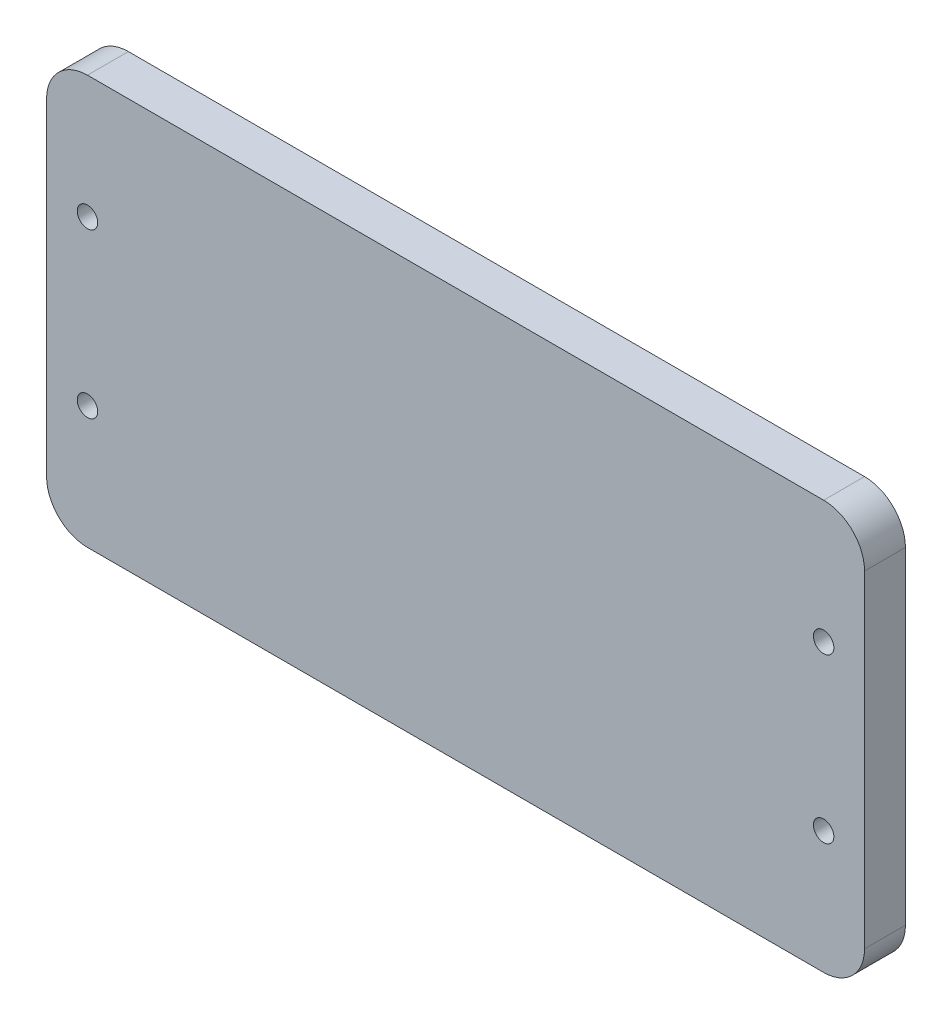
ISO-10303-21;
HEADER;
FILE_DESCRIPTION(('STEP AP214'),'2;1');
FILE_NAME('part.step','',(''),(''),'','','');
FILE_SCHEMA(('AUTOMOTIVE_DESIGN { 1 0 10303 214 1 1 1 1 }'));
ENDSEC;
DATA;
#1=APPLICATION_CONTEXT('core data for automotive mechanical design processes');
#2=APPLICATION_PROTOCOL_DEFINITION('international standard','automotive_design',2000,#1);
#3=PRODUCT_CONTEXT('',#1,'mechanical');
#4=PRODUCT('Part','Part','',(#3));
#5=PRODUCT_RELATED_PRODUCT_CATEGORY('part','',(#4));
#6=PRODUCT_DEFINITION_FORMATION('','',#4);
#7=PRODUCT_DEFINITION_CONTEXT('part definition',#1,'design');
#8=PRODUCT_DEFINITION('design','',#6,#7);
#9=PRODUCT_DEFINITION_SHAPE('','',#8);
#10=(LENGTH_UNIT() NAMED_UNIT(*) SI_UNIT(.MILLI.,.METRE.));
#11=(NAMED_UNIT(*) PLANE_ANGLE_UNIT() SI_UNIT($,.RADIAN.));
#12=(NAMED_UNIT(*) SI_UNIT($,.STERADIAN.) SOLID_ANGLE_UNIT());
#13=UNCERTAINTY_MEASURE_WITH_UNIT(LENGTH_MEASURE(1.E-05),#10,'distance_accuracy_value','');
#14=(GEOMETRIC_REPRESENTATION_CONTEXT(3) GLOBAL_UNCERTAINTY_ASSIGNED_CONTEXT((#13)) GLOBAL_UNIT_ASSIGNED_CONTEXT((#10,
#11,#12)) REPRESENTATION_CONTEXT('',''));
#15=CARTESIAN_POINT('',(0.,0.,0.));
#16=DIRECTION('',(0.,0.,1.));
#17=DIRECTION('',(1.,0.,0.));
#18=AXIS2_PLACEMENT_3D('',#15,#16,#17);
#19=CARTESIAN_POINT('',(0.,0.,10.));
#20=DIRECTION('',(0.,0.,1.));
#21=DIRECTION('',(1.,0.,0.));
#22=AXIS2_PLACEMENT_3D('',#19,#20,#21);
#23=PLANE('',#22);
#24=CARTESIAN_POINT('',(90.,-20.,10.));
#25=DIRECTION('',(0.,0.,1.));
#26=DIRECTION('',(-1.,0.,0.));
#27=AXIS2_PLACEMENT_3D('',#24,#25,#26);
#28=CIRCLE('',#27,2.5);
#29=CARTESIAN_POINT('',(87.5,-20.,10.));
#30=VERTEX_POINT('',#29);
#31=EDGE_CURVE('E188',#30,#30,#28,.T.);
#32=ORIENTED_EDGE('',*,*,#31,.F.);
#33=EDGE_LOOP('',(#32));
#34=FACE_BOUND('',#33,.T.);
#35=CARTESIAN_POINT('',(90.,20.,10.));
#36=DIRECTION('',(0.,0.,1.));
#37=DIRECTION('',(1.,0.,0.));
#38=AXIS2_PLACEMENT_3D('',#35,#36,#37);
#39=CIRCLE('',#38,2.5);
#40=CARTESIAN_POINT('',(92.5,20.,10.));
#41=VERTEX_POINT('',#40);
#42=EDGE_CURVE('E172',#41,#41,#39,.T.);
#43=ORIENTED_EDGE('',*,*,#42,.F.);
#44=EDGE_LOOP('',(#43));
#45=FACE_BOUND('',#44,.T.);
#46=DIRECTION('',(0.,-1.,0.));
#47=VECTOR('',#46,1.);
#48=CARTESIAN_POINT('',(-100.,50.,10.));
#49=LINE('',#48,#47);
#50=CARTESIAN_POINT('',(-100.,40.,10.));
#51=VERTEX_POINT('',#50);
#52=CARTESIAN_POINT('',(-100.,-40.,10.));
#53=VERTEX_POINT('',#52);
#54=EDGE_CURVE('E176',#51,#53,#49,.T.);
#55=ORIENTED_EDGE('',*,*,#54,.T.);
#56=CARTESIAN_POINT('',(-90.,-40.,10.));
#57=DIRECTION('',(0.,0.,1.));
#58=DIRECTION('',(1.,0.,0.));
#59=AXIS2_PLACEMENT_3D('',#56,#57,#58);
#60=CIRCLE('',#59,10.);
#61=CARTESIAN_POINT('',(-90.,-50.,10.));
#62=VERTEX_POINT('',#61);
#63=EDGE_CURVE('E153',#53,#62,#60,.T.);
#64=ORIENTED_EDGE('',*,*,#63,.T.);
#65=DIRECTION('',(1.,0.,0.));
#66=VECTOR('',#65,1.);
#67=CARTESIAN_POINT('',(-100.,-50.,10.));
#68=LINE('',#67,#66);
#69=CARTESIAN_POINT('',(90.,-50.,10.));
#70=VERTEX_POINT('',#69);
#71=EDGE_CURVE('E124',#62,#70,#68,.T.);
#72=ORIENTED_EDGE('',*,*,#71,.T.);
#73=CARTESIAN_POINT('',(90.,-40.,10.));
#74=DIRECTION('',(0.,0.,1.));
#75=DIRECTION('',(1.,0.,0.));
#76=AXIS2_PLACEMENT_3D('',#73,#74,#75);
#77=CIRCLE('',#76,10.);
#78=CARTESIAN_POINT('',(100.,-40.,10.));
#79=VERTEX_POINT('',#78);
#80=EDGE_CURVE('E149',#70,#79,#77,.T.);
#81=ORIENTED_EDGE('',*,*,#80,.T.);
#82=DIRECTION('',(0.,1.,0.));
#83=VECTOR('',#82,1.);
#84=CARTESIAN_POINT('',(100.,50.,10.));
#85=LINE('',#84,#83);
#86=CARTESIAN_POINT('',(100.,40.,10.));
#87=VERTEX_POINT('',#86);
#88=EDGE_CURVE('E132',#79,#87,#85,.T.);
#89=ORIENTED_EDGE('',*,*,#88,.T.);
#90=CARTESIAN_POINT('',(90.,40.,10.));
#91=DIRECTION('',(0.,0.,1.));
#92=DIRECTION('',(1.,0.,0.));
#93=AXIS2_PLACEMENT_3D('',#90,#91,#92);
#94=CIRCLE('',#93,10.);
#95=CARTESIAN_POINT('',(90.,50.,10.));
#96=VERTEX_POINT('',#95);
#97=EDGE_CURVE('E59',#87,#96,#94,.T.);
#98=ORIENTED_EDGE('',*,*,#97,.T.);
#99=DIRECTION('',(-1.,0.,0.));
#100=VECTOR('',#99,1.);
#101=CARTESIAN_POINT('',(-100.,50.,10.));
#102=LINE('',#101,#100);
#103=CARTESIAN_POINT('',(-90.,50.,10.));
#104=VERTEX_POINT('',#103);
#105=EDGE_CURVE('E135',#96,#104,#102,.T.);
#106=ORIENTED_EDGE('',*,*,#105,.T.);
#107=CARTESIAN_POINT('',(-90.,40.,10.));
#108=DIRECTION('',(0.,0.,1.));
#109=DIRECTION('',(1.,0.,0.));
#110=AXIS2_PLACEMENT_3D('',#107,#108,#109);
#111=CIRCLE('',#110,10.);
#112=EDGE_CURVE('E151',#104,#51,#111,.T.);
#113=ORIENTED_EDGE('',*,*,#112,.T.);
#114=EDGE_LOOP('',(#55,#64,#72,#81,#89,#98,#106,#113));
#115=FACE_BOUND('',#114,.T.);
#116=CARTESIAN_POINT('',(-90.,20.,10.));
#117=DIRECTION('',(0.,0.,1.));
#118=DIRECTION('',(-1.,0.,0.));
#119=AXIS2_PLACEMENT_3D('',#116,#117,#118);
#120=CIRCLE('',#119,2.5);
#121=CARTESIAN_POINT('',(-92.5,20.,10.));
#122=VERTEX_POINT('',#121);
#123=EDGE_CURVE('E182',#122,#122,#120,.T.);
#124=ORIENTED_EDGE('',*,*,#123,.F.);
#125=EDGE_LOOP('',(#124));
#126=FACE_BOUND('',#125,.T.);
#127=CARTESIAN_POINT('',(-90.,-20.,10.));
#128=DIRECTION('',(0.,0.,1.));
#129=DIRECTION('',(1.,0.,0.));
#130=AXIS2_PLACEMENT_3D('',#127,#128,#129);
#131=CIRCLE('',#130,2.5);
#132=CARTESIAN_POINT('',(-87.5,-20.,10.));
#133=VERTEX_POINT('',#132);
#134=EDGE_CURVE('E194',#133,#133,#131,.T.);
#135=ORIENTED_EDGE('',*,*,#134,.F.);
#136=EDGE_LOOP('',(#135));
#137=FACE_BOUND('',#136,.T.);
#138=ADVANCED_FACE('F37',(#34,#45,#115,#126,#137),#23,.T.);
#139=CARTESIAN_POINT('',(0.,0.,0.));
#140=DIRECTION('',(0.,0.,1.));
#141=DIRECTION('',(1.,0.,0.));
#142=AXIS2_PLACEMENT_3D('',#139,#140,#141);
#143=PLANE('',#142);
#144=DIRECTION('',(1.,0.,0.));
#145=VECTOR('',#144,1.);
#146=CARTESIAN_POINT('',(-100.,-50.,0.));
#147=LINE('',#146,#145);
#148=CARTESIAN_POINT('',(-90.,-50.,0.));
#149=VERTEX_POINT('',#148);
#150=CARTESIAN_POINT('',(90.,-50.,0.));
#151=VERTEX_POINT('',#150);
#152=EDGE_CURVE('E121',#149,#151,#147,.T.);
#153=ORIENTED_EDGE('',*,*,#152,.F.);
#154=CARTESIAN_POINT('',(-90.,-40.,0.));
#155=DIRECTION('',(0.,0.,1.));
#156=DIRECTION('',(1.,0.,0.));
#157=AXIS2_PLACEMENT_3D('',#154,#155,#156);
#158=CIRCLE('',#157,10.);
#159=CARTESIAN_POINT('',(-100.,-40.,0.));
#160=VERTEX_POINT('',#159);
#161=EDGE_CURVE('E104',#149,#160,#158,.F.);
#162=ORIENTED_EDGE('',*,*,#161,.T.);
#163=DIRECTION('',(0.,-1.,0.));
#164=VECTOR('',#163,1.);
#165=CARTESIAN_POINT('',(-100.,50.,0.));
#166=LINE('',#165,#164);
#167=CARTESIAN_POINT('',(-100.,40.,0.));
#168=VERTEX_POINT('',#167);
#169=EDGE_CURVE('E133',#168,#160,#166,.T.);
#170=ORIENTED_EDGE('',*,*,#169,.F.);
#171=CARTESIAN_POINT('',(-90.,40.,0.));
#172=DIRECTION('',(0.,0.,1.));
#173=DIRECTION('',(1.,0.,0.));
#174=AXIS2_PLACEMENT_3D('',#171,#172,#173);
#175=CIRCLE('',#174,10.);
#176=CARTESIAN_POINT('',(-90.,50.,0.));
#177=VERTEX_POINT('',#176);
#178=EDGE_CURVE('E115',#168,#177,#175,.F.);
#179=ORIENTED_EDGE('',*,*,#178,.T.);
#180=DIRECTION('',(-1.,0.,0.));
#181=VECTOR('',#180,1.);
#182=CARTESIAN_POINT('',(-100.,50.,0.));
#183=LINE('',#182,#181);
#184=CARTESIAN_POINT('',(90.,50.,0.));
#185=VERTEX_POINT('',#184);
#186=EDGE_CURVE('E137',#185,#177,#183,.T.);
#187=ORIENTED_EDGE('',*,*,#186,.F.);
#188=CARTESIAN_POINT('',(90.,40.,0.));
#189=DIRECTION('',(0.,0.,1.));
#190=DIRECTION('',(1.,0.,0.));
#191=AXIS2_PLACEMENT_3D('',#188,#189,#190);
#192=CIRCLE('',#191,10.);
#193=CARTESIAN_POINT('',(100.,40.,0.));
#194=VERTEX_POINT('',#193);
#195=EDGE_CURVE('E125',#185,#194,#192,.F.);
#196=ORIENTED_EDGE('',*,*,#195,.T.);
#197=DIRECTION('',(0.,1.,0.));
#198=VECTOR('',#197,1.);
#199=CARTESIAN_POINT('',(100.,50.,0.));
#200=LINE('',#199,#198);
#201=CARTESIAN_POINT('',(100.,-40.,0.));
#202=VERTEX_POINT('',#201);
#203=EDGE_CURVE('E164',#202,#194,#200,.T.);
#204=ORIENTED_EDGE('',*,*,#203,.F.);
#205=CARTESIAN_POINT('',(90.,-40.,0.));
#206=DIRECTION('',(0.,0.,1.));
#207=DIRECTION('',(1.,0.,0.));
#208=AXIS2_PLACEMENT_3D('',#205,#206,#207);
#209=CIRCLE('',#208,10.);
#210=EDGE_CURVE('E131',#202,#151,#209,.F.);
#211=ORIENTED_EDGE('',*,*,#210,.T.);
#212=EDGE_LOOP('',(#153,#162,#170,#179,#187,#196,#204,#211));
#213=FACE_BOUND('',#212,.T.);
#214=CARTESIAN_POINT('',(90.,20.,0.));
#215=DIRECTION('',(0.,0.,1.));
#216=DIRECTION('',(1.,0.,0.));
#217=AXIS2_PLACEMENT_3D('',#214,#215,#216);
#218=CIRCLE('',#217,2.5);
#219=CARTESIAN_POINT('',(92.5,20.,0.));
#220=VERTEX_POINT('',#219);
#221=EDGE_CURVE('E179',#220,#220,#218,.T.);
#222=ORIENTED_EDGE('',*,*,#221,.T.);
#223=EDGE_LOOP('',(#222));
#224=FACE_BOUND('',#223,.T.);
#225=CARTESIAN_POINT('',(-90.,20.,0.));
#226=DIRECTION('',(0.,0.,1.));
#227=DIRECTION('',(-1.,0.,0.));
#228=AXIS2_PLACEMENT_3D('',#225,#226,#227);
#229=CIRCLE('',#228,2.5);
#230=CARTESIAN_POINT('',(-92.5,20.,0.));
#231=VERTEX_POINT('',#230);
#232=EDGE_CURVE('E185',#231,#231,#229,.T.);
#233=ORIENTED_EDGE('',*,*,#232,.T.);
#234=EDGE_LOOP('',(#233));
#235=FACE_BOUND('',#234,.T.);
#236=CARTESIAN_POINT('',(90.,-20.,0.));
#237=DIRECTION('',(0.,0.,1.));
#238=DIRECTION('',(-1.,0.,0.));
#239=AXIS2_PLACEMENT_3D('',#236,#237,#238);
#240=CIRCLE('',#239,2.5);
#241=CARTESIAN_POINT('',(87.5,-20.,0.));
#242=VERTEX_POINT('',#241);
#243=EDGE_CURVE('E191',#242,#242,#240,.T.);
#244=ORIENTED_EDGE('',*,*,#243,.T.);
#245=EDGE_LOOP('',(#244));
#246=FACE_BOUND('',#245,.T.);
#247=CARTESIAN_POINT('',(-90.,-20.,0.));
#248=DIRECTION('',(0.,0.,1.));
#249=DIRECTION('',(1.,0.,0.));
#250=AXIS2_PLACEMENT_3D('',#247,#248,#249);
#251=CIRCLE('',#250,2.5);
#252=CARTESIAN_POINT('',(-87.5,-20.,0.));
#253=VERTEX_POINT('',#252);
#254=EDGE_CURVE('E197',#253,#253,#251,.T.);
#255=ORIENTED_EDGE('',*,*,#254,.T.);
#256=EDGE_LOOP('',(#255));
#257=FACE_BOUND('',#256,.T.);
#258=ADVANCED_FACE('F128',(#213,#224,#235,#246,#257),#143,.F.);
#259=CARTESIAN_POINT('',(100.,50.,10.));
#260=DIRECTION('',(-1.,0.,0.));
#261=DIRECTION('',(0.,-1.,0.));
#262=AXIS2_PLACEMENT_3D('',#259,#260,#261);
#263=PLANE('',#262);
#264=ORIENTED_EDGE('',*,*,#88,.F.);
#265=DIRECTION('',(0.,0.,-1.));
#266=VECTOR('',#265,1.);
#267=CARTESIAN_POINT('',(100.,-40.,10.));
#268=LINE('',#267,#266);
#269=EDGE_CURVE('E11',#79,#202,#268,.T.);
#270=ORIENTED_EDGE('',*,*,#269,.T.);
#271=ORIENTED_EDGE('',*,*,#203,.T.);
#272=DIRECTION('',(0.,0.,-1.));
#273=VECTOR('',#272,1.);
#274=CARTESIAN_POINT('',(100.,40.,10.));
#275=LINE('',#274,#273);
#276=EDGE_CURVE('E45',#194,#87,#275,.F.);
#277=ORIENTED_EDGE('',*,*,#276,.T.);
#278=EDGE_LOOP('',(#264,#270,#271,#277));
#279=FACE_BOUND('',#278,.T.);
#280=ADVANCED_FACE('F162',(#279),#263,.F.);
#281=CARTESIAN_POINT('',(-100.,50.,10.));
#282=DIRECTION('',(0.,-1.,0.));
#283=DIRECTION('',(0.,0.,-1.));
#284=AXIS2_PLACEMENT_3D('',#281,#282,#283);
#285=PLANE('',#284);
#286=ORIENTED_EDGE('',*,*,#186,.T.);
#287=DIRECTION('',(0.,0.,-1.));
#288=VECTOR('',#287,1.);
#289=CARTESIAN_POINT('',(-90.,50.,10.));
#290=LINE('',#289,#288);
#291=EDGE_CURVE('E52',#177,#104,#290,.F.);
#292=ORIENTED_EDGE('',*,*,#291,.T.);
#293=ORIENTED_EDGE('',*,*,#105,.F.);
#294=DIRECTION('',(0.,0.,-1.));
#295=VECTOR('',#294,1.);
#296=CARTESIAN_POINT('',(90.,50.,10.));
#297=LINE('',#296,#295);
#298=EDGE_CURVE('E155',#96,#185,#297,.T.);
#299=ORIENTED_EDGE('',*,*,#298,.T.);
#300=EDGE_LOOP('',(#286,#292,#293,#299));
#301=FACE_BOUND('',#300,.T.);
#302=ADVANCED_FACE('F171',(#301),#285,.F.);
#303=CARTESIAN_POINT('',(-100.,50.,10.));
#304=DIRECTION('',(1.,0.,0.));
#305=DIRECTION('',(0.,1.,0.));
#306=AXIS2_PLACEMENT_3D('',#303,#304,#305);
#307=PLANE('',#306);
#308=ORIENTED_EDGE('',*,*,#169,.T.);
#309=DIRECTION('',(0.,0.,-1.));
#310=VECTOR('',#309,1.);
#311=CARTESIAN_POINT('',(-100.,-40.,10.));
#312=LINE('',#311,#310);
#313=EDGE_CURVE('E109',#160,#53,#312,.F.);
#314=ORIENTED_EDGE('',*,*,#313,.T.);
#315=ORIENTED_EDGE('',*,*,#54,.F.);
#316=DIRECTION('',(0.,0.,-1.));
#317=VECTOR('',#316,1.);
#318=CARTESIAN_POINT('',(-100.,40.,10.));
#319=LINE('',#318,#317);
#320=EDGE_CURVE('E114',#51,#168,#319,.T.);
#321=ORIENTED_EDGE('',*,*,#320,.T.);
#322=EDGE_LOOP('',(#308,#314,#315,#321));
#323=FACE_BOUND('',#322,.T.);
#324=ADVANCED_FACE('F221',(#323),#307,.F.);
#325=CARTESIAN_POINT('',(-100.,-50.,10.));
#326=DIRECTION('',(0.,1.,0.));
#327=DIRECTION('',(0.,0.,1.));
#328=AXIS2_PLACEMENT_3D('',#325,#326,#327);
#329=PLANE('',#328);
#330=ORIENTED_EDGE('',*,*,#71,.F.);
#331=DIRECTION('',(0.,0.,-1.));
#332=VECTOR('',#331,1.);
#333=CARTESIAN_POINT('',(-90.,-50.,10.));
#334=LINE('',#333,#332);
#335=EDGE_CURVE('E108',#62,#149,#334,.T.);
#336=ORIENTED_EDGE('',*,*,#335,.T.);
#337=ORIENTED_EDGE('',*,*,#152,.T.);
#338=DIRECTION('',(0.,0.,-1.));
#339=VECTOR('',#338,1.);
#340=CARTESIAN_POINT('',(90.,-50.,10.));
#341=LINE('',#340,#339);
#342=EDGE_CURVE('E126',#151,#70,#341,.F.);
#343=ORIENTED_EDGE('',*,*,#342,.T.);
#344=EDGE_LOOP('',(#330,#336,#337,#343));
#345=FACE_BOUND('',#344,.T.);
#346=ADVANCED_FACE('F120',(#345),#329,.F.);
#347=CARTESIAN_POINT('',(90.,20.,10.));
#348=DIRECTION('',(0.,0.,-1.));
#349=DIRECTION('',(-1.,0.,0.));
#350=AXIS2_PLACEMENT_3D('',#347,#348,#349);
#351=CYLINDRICAL_SURFACE('',#350,2.5);
#352=ORIENTED_EDGE('',*,*,#42,.T.);
#353=EDGE_LOOP('',(#352));
#354=FACE_BOUND('',#353,.T.);
#355=ORIENTED_EDGE('',*,*,#221,.F.);
#356=EDGE_LOOP('',(#355));
#357=FACE_BOUND('',#356,.T.);
#358=ADVANCED_FACE('F216',(#354,#357),#351,.F.);
#359=CARTESIAN_POINT('',(-90.,20.,10.));
#360=DIRECTION('',(0.,0.,-1.));
#361=DIRECTION('',(-1.,0.,0.));
#362=AXIS2_PLACEMENT_3D('',#359,#360,#361);
#363=CYLINDRICAL_SURFACE('',#362,2.5);
#364=ORIENTED_EDGE('',*,*,#123,.T.);
#365=EDGE_LOOP('',(#364));
#366=FACE_BOUND('',#365,.T.);
#367=ORIENTED_EDGE('',*,*,#232,.F.);
#368=EDGE_LOOP('',(#367));
#369=FACE_BOUND('',#368,.T.);
#370=ADVANCED_FACE('F315',(#366,#369),#363,.F.);
#371=CARTESIAN_POINT('',(90.,-20.,10.));
#372=DIRECTION('',(0.,0.,-1.));
#373=DIRECTION('',(-1.,0.,0.));
#374=AXIS2_PLACEMENT_3D('',#371,#372,#373);
#375=CYLINDRICAL_SURFACE('',#374,2.5);
#376=ORIENTED_EDGE('',*,*,#31,.T.);
#377=EDGE_LOOP('',(#376));
#378=FACE_BOUND('',#377,.T.);
#379=ORIENTED_EDGE('',*,*,#243,.F.);
#380=EDGE_LOOP('',(#379));
#381=FACE_BOUND('',#380,.T.);
#382=ADVANCED_FACE('F306',(#378,#381),#375,.F.);
#383=CARTESIAN_POINT('',(-90.,-20.,10.));
#384=DIRECTION('',(0.,0.,-1.));
#385=DIRECTION('',(-1.,0.,0.));
#386=AXIS2_PLACEMENT_3D('',#383,#384,#385);
#387=CYLINDRICAL_SURFACE('',#386,2.5);
#388=ORIENTED_EDGE('',*,*,#134,.T.);
#389=EDGE_LOOP('',(#388));
#390=FACE_BOUND('',#389,.T.);
#391=ORIENTED_EDGE('',*,*,#254,.F.);
#392=EDGE_LOOP('',(#391));
#393=FACE_BOUND('',#392,.T.);
#394=ADVANCED_FACE('F203',(#390,#393),#387,.F.);
#395=CARTESIAN_POINT('',(-90.,-40.,10.));
#396=DIRECTION('',(0.,0.,-1.));
#397=DIRECTION('',(-1.,0.,0.));
#398=AXIS2_PLACEMENT_3D('',#395,#396,#397);
#399=CYLINDRICAL_SURFACE('',#398,10.);
#400=ORIENTED_EDGE('',*,*,#63,.F.);
#401=ORIENTED_EDGE('',*,*,#313,.F.);
#402=ORIENTED_EDGE('',*,*,#161,.F.);
#403=ORIENTED_EDGE('',*,*,#335,.F.);
#404=EDGE_LOOP('',(#400,#401,#402,#403));
#405=FACE_BOUND('',#404,.T.);
#406=ADVANCED_FACE('F107',(#405),#399,.T.);
#407=CARTESIAN_POINT('',(-90.,40.,10.));
#408=DIRECTION('',(0.,0.,-1.));
#409=DIRECTION('',(-1.,0.,0.));
#410=AXIS2_PLACEMENT_3D('',#407,#408,#409);
#411=CYLINDRICAL_SURFACE('',#410,10.);
#412=ORIENTED_EDGE('',*,*,#112,.F.);
#413=ORIENTED_EDGE('',*,*,#291,.F.);
#414=ORIENTED_EDGE('',*,*,#178,.F.);
#415=ORIENTED_EDGE('',*,*,#320,.F.);
#416=EDGE_LOOP('',(#412,#413,#414,#415));
#417=FACE_BOUND('',#416,.T.);
#418=ADVANCED_FACE('F231',(#417),#411,.T.);
#419=CARTESIAN_POINT('',(90.,-40.,10.));
#420=DIRECTION('',(0.,0.,-1.));
#421=DIRECTION('',(-1.,0.,0.));
#422=AXIS2_PLACEMENT_3D('',#419,#420,#421);
#423=CYLINDRICAL_SURFACE('',#422,10.);
#424=ORIENTED_EDGE('',*,*,#80,.F.);
#425=ORIENTED_EDGE('',*,*,#342,.F.);
#426=ORIENTED_EDGE('',*,*,#210,.F.);
#427=ORIENTED_EDGE('',*,*,#269,.F.);
#428=EDGE_LOOP('',(#424,#425,#426,#427));
#429=FACE_BOUND('',#428,.T.);
#430=ADVANCED_FACE('F233',(#429),#423,.T.);
#431=CARTESIAN_POINT('',(90.,40.,10.));
#432=DIRECTION('',(0.,0.,-1.));
#433=DIRECTION('',(-1.,0.,0.));
#434=AXIS2_PLACEMENT_3D('',#431,#432,#433);
#435=CYLINDRICAL_SURFACE('',#434,10.);
#436=ORIENTED_EDGE('',*,*,#97,.F.);
#437=ORIENTED_EDGE('',*,*,#276,.F.);
#438=ORIENTED_EDGE('',*,*,#195,.F.);
#439=ORIENTED_EDGE('',*,*,#298,.F.);
#440=EDGE_LOOP('',(#436,#437,#438,#439));
#441=FACE_BOUND('',#440,.T.);
#442=ADVANCED_FACE('F39',(#441),#435,.T.);
#443=CLOSED_SHELL('',(#138,#258,#280,#302,#324,#346,#358,#370,#382,#394,#406,#418,#430,#442));
#444=MANIFOLD_SOLID_BREP('B2',#443);
#445=ADVANCED_BREP_SHAPE_REPRESENTATION('',(#18,#444),#14);
#446=SHAPE_DEFINITION_REPRESENTATION(#9,#445);
ENDSEC;
END-ISO-10303-21;
